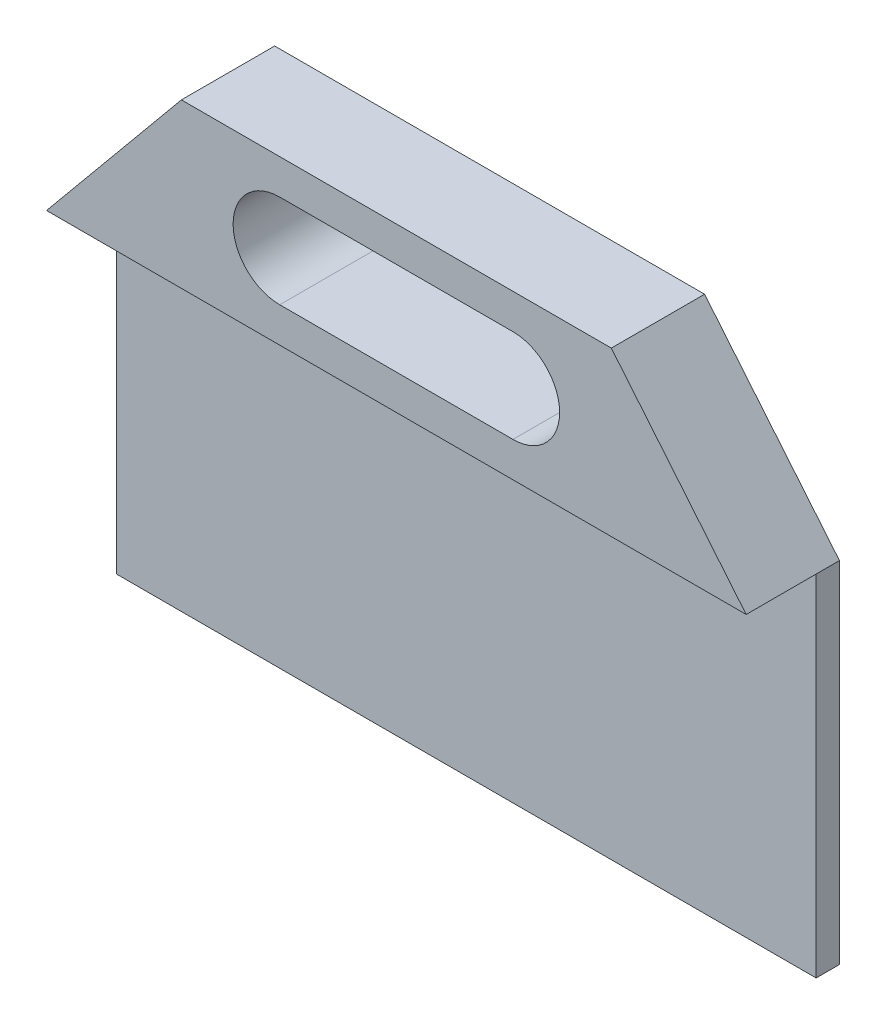
ISO-10303-21;
HEADER;
FILE_DESCRIPTION(('STEP AP214'),'2;1');
FILE_NAME('part.step','',(''),(''),'','','');
FILE_SCHEMA(('AUTOMOTIVE_DESIGN { 1 0 10303 214 1 1 1 1 }'));
ENDSEC;
DATA;
#1=APPLICATION_CONTEXT('core data for automotive mechanical design processes');
#2=APPLICATION_PROTOCOL_DEFINITION('international standard','automotive_design',2000,#1);
#3=PRODUCT_CONTEXT('',#1,'mechanical');
#4=PRODUCT('Part','Part','',(#3));
#5=PRODUCT_RELATED_PRODUCT_CATEGORY('part','',(#4));
#6=PRODUCT_DEFINITION_FORMATION('','',#4);
#7=PRODUCT_DEFINITION_CONTEXT('part definition',#1,'design');
#8=PRODUCT_DEFINITION('design','',#6,#7);
#9=PRODUCT_DEFINITION_SHAPE('','',#8);
#10=(LENGTH_UNIT() NAMED_UNIT(*) SI_UNIT(.MILLI.,.METRE.));
#11=(NAMED_UNIT(*) PLANE_ANGLE_UNIT() SI_UNIT($,.RADIAN.));
#12=(NAMED_UNIT(*) SI_UNIT($,.STERADIAN.) SOLID_ANGLE_UNIT());
#13=UNCERTAINTY_MEASURE_WITH_UNIT(LENGTH_MEASURE(1.E-05),#10,'distance_accuracy_value','');
#14=(GEOMETRIC_REPRESENTATION_CONTEXT(3) GLOBAL_UNCERTAINTY_ASSIGNED_CONTEXT((#13)) GLOBAL_UNIT_ASSIGNED_CONTEXT((#10,
#11,#12)) REPRESENTATION_CONTEXT('',''));
#15=CARTESIAN_POINT('',(0.,0.,0.));
#16=DIRECTION('',(0.,0.,1.));
#17=DIRECTION('',(1.,0.,0.));
#18=AXIS2_PLACEMENT_3D('',#15,#16,#17);
#19=CARTESIAN_POINT('',(-15.,0.,1.));
#20=DIRECTION('',(-1.,0.,0.));
#21=DIRECTION('',(0.,0.,1.));
#22=AXIS2_PLACEMENT_3D('',#19,#20,#21);
#23=PLANE('',#22);
#24=DIRECTION('',(0.,1.,0.));
#25=VECTOR('',#24,1.);
#26=CARTESIAN_POINT('',(-15.,0.,0.));
#27=LINE('',#26,#25);
#28=CARTESIAN_POINT('',(-15.,-7.50000000000001,0.));
#29=VERTEX_POINT('',#28);
#30=CARTESIAN_POINT('',(-15.,7.49999999999999,0.));
#31=VERTEX_POINT('',#30);
#32=EDGE_CURVE('E80',#29,#31,#27,.T.);
#33=ORIENTED_EDGE('',*,*,#32,.F.);
#34=DIRECTION('',(0.,0.,-1.));
#35=VECTOR('',#34,1.);
#36=CARTESIAN_POINT('',(-15.,-7.50000000000001,1.));
#37=LINE('',#36,#35);
#38=CARTESIAN_POINT('',(-15.,-7.50000000000001,1.));
#39=VERTEX_POINT('',#38);
#40=EDGE_CURVE('E11',#39,#29,#37,.T.);
#41=ORIENTED_EDGE('',*,*,#40,.F.);
#42=DIRECTION('',(0.,1.,0.));
#43=VECTOR('',#42,1.);
#44=CARTESIAN_POINT('',(-15.,0.,1.));
#45=LINE('',#44,#43);
#46=CARTESIAN_POINT('',(-15.,7.49999999999999,1.));
#47=VERTEX_POINT('',#46);
#48=EDGE_CURVE('E78',#39,#47,#45,.T.);
#49=ORIENTED_EDGE('',*,*,#48,.T.);
#50=DIRECTION('',(0.,0.,-1.));
#51=VECTOR('',#50,1.);
#52=CARTESIAN_POINT('',(-15.,7.49999999999999,1.));
#53=LINE('',#52,#51);
#54=EDGE_CURVE('E97',#47,#31,#53,.T.);
#55=ORIENTED_EDGE('',*,*,#54,.T.);
#56=EDGE_LOOP('',(#33,#41,#49,#55));
#57=FACE_BOUND('',#56,.T.);
#58=ADVANCED_FACE('F33',(#57),#23,.T.);
#59=CARTESIAN_POINT('',(0.,-7.50000000000001,1.));
#60=DIRECTION('',(0.,-1.,0.));
#61=DIRECTION('',(1.,0.,0.));
#62=AXIS2_PLACEMENT_3D('',#59,#60,#61);
#63=PLANE('',#62);
#64=DIRECTION('',(-1.,0.,0.));
#65=VECTOR('',#64,1.);
#66=CARTESIAN_POINT('',(0.,-7.50000000000001,0.));
#67=LINE('',#66,#65);
#68=CARTESIAN_POINT('',(15.,-7.50000000000001,0.));
#69=VERTEX_POINT('',#68);
#70=EDGE_CURVE('E99',#69,#29,#67,.T.);
#71=ORIENTED_EDGE('',*,*,#70,.F.);
#72=DIRECTION('',(0.,0.,-1.));
#73=VECTOR('',#72,1.);
#74=CARTESIAN_POINT('',(15.,-7.50000000000001,1.));
#75=LINE('',#74,#73);
#76=CARTESIAN_POINT('',(15.,-7.50000000000001,1.));
#77=VERTEX_POINT('',#76);
#78=EDGE_CURVE('E41',#77,#69,#75,.T.);
#79=ORIENTED_EDGE('',*,*,#78,.F.);
#80=DIRECTION('',(-1.,0.,0.));
#81=VECTOR('',#80,1.);
#82=CARTESIAN_POINT('',(0.,-7.50000000000001,1.));
#83=LINE('',#82,#81);
#84=EDGE_CURVE('E86',#77,#39,#83,.T.);
#85=ORIENTED_EDGE('',*,*,#84,.T.);
#86=ORIENTED_EDGE('',*,*,#40,.T.);
#87=EDGE_LOOP('',(#71,#79,#85,#86));
#88=FACE_BOUND('',#87,.T.);
#89=ADVANCED_FACE('F89',(#88),#63,.T.);
#90=CARTESIAN_POINT('',(15.,0.,1.));
#91=DIRECTION('',(-1.,0.,0.));
#92=DIRECTION('',(0.,-1.,0.));
#93=AXIS2_PLACEMENT_3D('',#90,#91,#92);
#94=PLANE('',#93);
#95=DIRECTION('',(0.,1.,0.));
#96=VECTOR('',#95,1.);
#97=CARTESIAN_POINT('',(15.,0.,0.));
#98=LINE('',#97,#96);
#99=CARTESIAN_POINT('',(15.,7.49999999999999,0.));
#100=VERTEX_POINT('',#99);
#101=EDGE_CURVE('E87',#69,#100,#98,.T.);
#102=ORIENTED_EDGE('',*,*,#101,.T.);
#103=DIRECTION('',(0.,0.,-1.));
#104=VECTOR('',#103,1.);
#105=CARTESIAN_POINT('',(15.,7.49999999999999,1.));
#106=LINE('',#105,#104);
#107=CARTESIAN_POINT('',(15.,7.49999999999999,1.));
#108=VERTEX_POINT('',#107);
#109=EDGE_CURVE('E105',#108,#100,#106,.T.);
#110=ORIENTED_EDGE('',*,*,#109,.F.);
#111=DIRECTION('',(0.,1.,0.));
#112=VECTOR('',#111,1.);
#113=CARTESIAN_POINT('',(15.,0.,1.));
#114=LINE('',#113,#112);
#115=EDGE_CURVE('E91',#77,#108,#114,.T.);
#116=ORIENTED_EDGE('',*,*,#115,.F.);
#117=ORIENTED_EDGE('',*,*,#78,.T.);
#118=EDGE_LOOP('',(#102,#110,#116,#117));
#119=FACE_BOUND('',#118,.T.);
#120=ADVANCED_FACE('F109',(#119),#94,.F.);
#121=CARTESIAN_POINT('',(0.,0.,1.));
#122=DIRECTION('',(0.,0.,1.));
#123=DIRECTION('',(1.,0.,0.));
#124=AXIS2_PLACEMENT_3D('',#121,#122,#123);
#125=PLANE('',#124);
#126=ORIENTED_EDGE('',*,*,#48,.F.);
#127=ORIENTED_EDGE('',*,*,#84,.F.);
#128=ORIENTED_EDGE('',*,*,#115,.T.);
#129=DIRECTION('',(-1.,0.,0.));
#130=VECTOR('',#129,1.);
#131=CARTESIAN_POINT('',(0.,7.49999999999999,1.));
#132=LINE('',#131,#130);
#133=EDGE_CURVE('E67',#108,#47,#132,.T.);
#134=ORIENTED_EDGE('',*,*,#133,.T.);
#135=EDGE_LOOP('',(#126,#127,#128,#134));
#136=FACE_BOUND('',#135,.T.);
#137=ADVANCED_FACE('F84',(#136),#125,.T.);
#138=CARTESIAN_POINT('',(0.,0.,0.));
#139=DIRECTION('',(0.,0.,1.));
#140=DIRECTION('',(1.,0.,0.));
#141=AXIS2_PLACEMENT_3D('',#138,#139,#140);
#142=PLANE('',#141);
#143=ORIENTED_EDGE('',*,*,#32,.T.);
#144=DIRECTION('',(0.63688985212534,0.77095480818253,0.));
#145=VECTOR('',#144,1.);
#146=CARTESIAN_POINT('',(-12.5981694472366,10.4074145347322,0.));
#147=LINE('',#146,#145);
#148=CARTESIAN_POINT('',(-9.21726290885022,14.5,0.));
#149=VERTEX_POINT('',#148);
#150=EDGE_CURVE('E129',#31,#149,#147,.T.);
#151=ORIENTED_EDGE('',*,*,#150,.T.);
#152=DIRECTION('',(1.,0.,0.));
#153=VECTOR('',#152,1.);
#154=CARTESIAN_POINT('',(0.,14.5,0.));
#155=LINE('',#154,#153);
#156=CARTESIAN_POINT('',(9.21726290885023,14.5,0.));
#157=VERTEX_POINT('',#156);
#158=EDGE_CURVE('E122',#149,#157,#155,.T.);
#159=ORIENTED_EDGE('',*,*,#158,.T.);
#160=DIRECTION('',(-0.63688985212534,0.770954808182531,0.));
#161=VECTOR('',#160,1.);
#162=CARTESIAN_POINT('',(12.5981694472366,10.4074145347322,0.));
#163=LINE('',#162,#161);
#164=EDGE_CURVE('E118',#100,#157,#163,.T.);
#165=ORIENTED_EDGE('',*,*,#164,.F.);
#166=ORIENTED_EDGE('',*,*,#101,.F.);
#167=ORIENTED_EDGE('',*,*,#70,.T.);
#168=EDGE_LOOP('',(#143,#151,#159,#165,#166,#167));
#169=FACE_BOUND('',#168,.T.);
#170=CARTESIAN_POINT('',(5.,11.,0.));
#171=DIRECTION('',(0.,0.,1.));
#172=DIRECTION('',(1.,0.,0.));
#173=AXIS2_PLACEMENT_3D('',#170,#171,#172);
#174=CIRCLE('',#173,2.);
#175=CARTESIAN_POINT('',(5.,9.,0.));
#176=VERTEX_POINT('',#175);
#177=CARTESIAN_POINT('',(5.,13.,0.));
#178=VERTEX_POINT('',#177);
#179=EDGE_CURVE('E177',#176,#178,#174,.T.);
#180=ORIENTED_EDGE('',*,*,#179,.T.);
#181=DIRECTION('',(1.,0.,0.));
#182=VECTOR('',#181,1.);
#183=CARTESIAN_POINT('',(0.,13.,0.));
#184=LINE('',#183,#182);
#185=CARTESIAN_POINT('',(-5.,13.,0.));
#186=VERTEX_POINT('',#185);
#187=EDGE_CURVE('E127',#186,#178,#184,.T.);
#188=ORIENTED_EDGE('',*,*,#187,.F.);
#189=CARTESIAN_POINT('',(-5.,11.,0.));
#190=DIRECTION('',(0.,0.,1.));
#191=DIRECTION('',(1.,0.,0.));
#192=AXIS2_PLACEMENT_3D('',#189,#190,#191);
#193=CIRCLE('',#192,2.);
#194=CARTESIAN_POINT('',(-5.,8.99999999999999,0.));
#195=VERTEX_POINT('',#194);
#196=EDGE_CURVE('E132',#186,#195,#193,.T.);
#197=ORIENTED_EDGE('',*,*,#196,.T.);
#198=DIRECTION('',(1.,0.,0.));
#199=VECTOR('',#198,1.);
#200=CARTESIAN_POINT('',(0.,8.99999999999999,0.));
#201=LINE('',#200,#199);
#202=EDGE_CURVE('E167',#195,#176,#201,.T.);
#203=ORIENTED_EDGE('',*,*,#202,.T.);
#204=EDGE_LOOP('',(#180,#188,#197,#203));
#205=FACE_BOUND('',#204,.T.);
#206=ADVANCED_FACE('F114',(#169,#205),#142,.F.);
#207=CARTESIAN_POINT('',(0.,7.49999999999999,4.));
#208=DIRECTION('',(0.,-1.,0.));
#209=DIRECTION('',(1.,0.,0.));
#210=AXIS2_PLACEMENT_3D('',#207,#208,#209);
#211=PLANE('',#210);
#212=ORIENTED_EDGE('',*,*,#133,.F.);
#213=DIRECTION('',(0.,0.,-1.));
#214=VECTOR('',#213,1.);
#215=CARTESIAN_POINT('',(15.,7.49999999999999,4.));
#216=LINE('',#215,#214);
#217=CARTESIAN_POINT('',(15.,7.49999999999999,4.));
#218=VERTEX_POINT('',#217);
#219=EDGE_CURVE('E100',#218,#108,#216,.T.);
#220=ORIENTED_EDGE('',*,*,#219,.F.);
#221=DIRECTION('',(-1.,0.,0.));
#222=VECTOR('',#221,1.);
#223=CARTESIAN_POINT('',(0.,7.49999999999999,4.));
#224=LINE('',#223,#222);
#225=CARTESIAN_POINT('',(-15.,7.49999999999999,4.));
#226=VERTEX_POINT('',#225);
#227=EDGE_CURVE('E193',#218,#226,#224,.T.);
#228=ORIENTED_EDGE('',*,*,#227,.T.);
#229=DIRECTION('',(0.,0.,-1.));
#230=VECTOR('',#229,1.);
#231=CARTESIAN_POINT('',(-15.,7.49999999999999,4.));
#232=LINE('',#231,#230);
#233=EDGE_CURVE('E49',#226,#47,#232,.T.);
#234=ORIENTED_EDGE('',*,*,#233,.T.);
#235=EDGE_LOOP('',(#212,#220,#228,#234));
#236=FACE_BOUND('',#235,.T.);
#237=ADVANCED_FACE('F237',(#236),#211,.T.);
#238=CARTESIAN_POINT('',(12.5981694472366,10.4074145347322,4.));
#239=DIRECTION('',(-0.770954808182531,-0.63688985212534,0.));
#240=DIRECTION('',(0.63688985212534,-0.770954808182531,0.));
#241=AXIS2_PLACEMENT_3D('',#238,#239,#240);
#242=PLANE('',#241);
#243=ORIENTED_EDGE('',*,*,#164,.T.);
#244=DIRECTION('',(0.,0.,-1.));
#245=VECTOR('',#244,1.);
#246=CARTESIAN_POINT('',(9.21726290885023,14.5,4.));
#247=LINE('',#246,#245);
#248=CARTESIAN_POINT('',(9.21726290885023,14.5,4.));
#249=VERTEX_POINT('',#248);
#250=EDGE_CURVE('E143',#249,#157,#247,.T.);
#251=ORIENTED_EDGE('',*,*,#250,.F.);
#252=DIRECTION('',(-0.63688985212534,0.770954808182531,0.));
#253=VECTOR('',#252,1.);
#254=CARTESIAN_POINT('',(12.5981694472366,10.4074145347322,4.));
#255=LINE('',#254,#253);
#256=EDGE_CURVE('E190',#218,#249,#255,.T.);
#257=ORIENTED_EDGE('',*,*,#256,.F.);
#258=ORIENTED_EDGE('',*,*,#219,.T.);
#259=ORIENTED_EDGE('',*,*,#109,.T.);
#260=EDGE_LOOP('',(#243,#251,#257,#258,#259));
#261=FACE_BOUND('',#260,.T.);
#262=ADVANCED_FACE('F235',(#261),#242,.F.);
#263=CARTESIAN_POINT('',(0.,14.5,4.));
#264=DIRECTION('',(0.,1.,0.));
#265=DIRECTION('',(-1.,0.,0.));
#266=AXIS2_PLACEMENT_3D('',#263,#264,#265);
#267=PLANE('',#266);
#268=ORIENTED_EDGE('',*,*,#158,.F.);
#269=DIRECTION('',(0.,0.,-1.));
#270=VECTOR('',#269,1.);
#271=CARTESIAN_POINT('',(-9.21726290885022,14.5,4.));
#272=LINE('',#271,#270);
#273=CARTESIAN_POINT('',(-9.21726290885022,14.5,4.));
#274=VERTEX_POINT('',#273);
#275=EDGE_CURVE('E139',#274,#149,#272,.T.);
#276=ORIENTED_EDGE('',*,*,#275,.F.);
#277=DIRECTION('',(1.,0.,0.));
#278=VECTOR('',#277,1.);
#279=CARTESIAN_POINT('',(0.,14.5,4.));
#280=LINE('',#279,#278);
#281=EDGE_CURVE('E187',#274,#249,#280,.T.);
#282=ORIENTED_EDGE('',*,*,#281,.T.);
#283=ORIENTED_EDGE('',*,*,#250,.T.);
#284=EDGE_LOOP('',(#268,#276,#282,#283));
#285=FACE_BOUND('',#284,.T.);
#286=ADVANCED_FACE('F233',(#285),#267,.T.);
#287=CARTESIAN_POINT('',(5.,11.,4.));
#288=DIRECTION('',(0.,0.,-1.));
#289=DIRECTION('',(-1.,0.,0.));
#290=AXIS2_PLACEMENT_3D('',#287,#288,#289);
#291=CYLINDRICAL_SURFACE('',#290,2.);
#292=ORIENTED_EDGE('',*,*,#179,.F.);
#293=DIRECTION('',(0.,0.,-1.));
#294=VECTOR('',#293,1.);
#295=CARTESIAN_POINT('',(5.,9.,4.));
#296=LINE('',#295,#294);
#297=CARTESIAN_POINT('',(5.,9.,4.));
#298=VERTEX_POINT('',#297);
#299=EDGE_CURVE('E140',#298,#176,#296,.T.);
#300=ORIENTED_EDGE('',*,*,#299,.F.);
#301=CARTESIAN_POINT('',(5.,11.,4.));
#302=DIRECTION('',(0.,0.,1.));
#303=DIRECTION('',(1.,0.,0.));
#304=AXIS2_PLACEMENT_3D('',#301,#302,#303);
#305=CIRCLE('',#304,2.);
#306=CARTESIAN_POINT('',(5.,13.,4.));
#307=VERTEX_POINT('',#306);
#308=EDGE_CURVE('E137',#298,#307,#305,.T.);
#309=ORIENTED_EDGE('',*,*,#308,.T.);
#310=DIRECTION('',(0.,0.,-1.));
#311=VECTOR('',#310,1.);
#312=CARTESIAN_POINT('',(5.,13.,4.));
#313=LINE('',#312,#311);
#314=EDGE_CURVE('E147',#307,#178,#313,.T.);
#315=ORIENTED_EDGE('',*,*,#314,.T.);
#316=EDGE_LOOP('',(#292,#300,#309,#315));
#317=FACE_BOUND('',#316,.T.);
#318=ADVANCED_FACE('F178',(#317),#291,.F.);
#319=CARTESIAN_POINT('',(0.,8.99999999999999,4.));
#320=DIRECTION('',(0.,1.,0.));
#321=DIRECTION('',(-1.,0.,0.));
#322=AXIS2_PLACEMENT_3D('',#319,#320,#321);
#323=PLANE('',#322);
#324=ORIENTED_EDGE('',*,*,#202,.F.);
#325=DIRECTION('',(0.,0.,-1.));
#326=VECTOR('',#325,1.);
#327=CARTESIAN_POINT('',(-5.,8.99999999999999,4.));
#328=LINE('',#327,#326);
#329=CARTESIAN_POINT('',(-5.,8.99999999999999,4.));
#330=VERTEX_POINT('',#329);
#331=EDGE_CURVE('E154',#330,#195,#328,.T.);
#332=ORIENTED_EDGE('',*,*,#331,.F.);
#333=DIRECTION('',(1.,0.,0.));
#334=VECTOR('',#333,1.);
#335=CARTESIAN_POINT('',(0.,8.99999999999999,4.));
#336=LINE('',#335,#334);
#337=EDGE_CURVE('E171',#330,#298,#336,.T.);
#338=ORIENTED_EDGE('',*,*,#337,.T.);
#339=ORIENTED_EDGE('',*,*,#299,.T.);
#340=EDGE_LOOP('',(#324,#332,#338,#339));
#341=FACE_BOUND('',#340,.T.);
#342=ADVANCED_FACE('F163',(#341),#323,.T.);
#343=CARTESIAN_POINT('',(-5.,11.,4.));
#344=DIRECTION('',(0.,0.,-1.));
#345=DIRECTION('',(-1.,0.,0.));
#346=AXIS2_PLACEMENT_3D('',#343,#344,#345);
#347=CYLINDRICAL_SURFACE('',#346,2.);
#348=ORIENTED_EDGE('',*,*,#196,.F.);
#349=DIRECTION('',(0.,0.,-1.));
#350=VECTOR('',#349,1.);
#351=CARTESIAN_POINT('',(-5.,13.,4.));
#352=LINE('',#351,#350);
#353=CARTESIAN_POINT('',(-5.,13.,4.));
#354=VERTEX_POINT('',#353);
#355=EDGE_CURVE('E150',#354,#186,#352,.T.);
#356=ORIENTED_EDGE('',*,*,#355,.F.);
#357=CARTESIAN_POINT('',(-5.,11.,4.));
#358=DIRECTION('',(0.,0.,1.));
#359=DIRECTION('',(1.,0.,0.));
#360=AXIS2_PLACEMENT_3D('',#357,#358,#359);
#361=CIRCLE('',#360,2.);
#362=EDGE_CURVE('E198',#354,#330,#361,.T.);
#363=ORIENTED_EDGE('',*,*,#362,.T.);
#364=ORIENTED_EDGE('',*,*,#331,.T.);
#365=EDGE_LOOP('',(#348,#356,#363,#364));
#366=FACE_BOUND('',#365,.T.);
#367=ADVANCED_FACE('F262',(#366),#347,.F.);
#368=CARTESIAN_POINT('',(0.,13.,4.));
#369=DIRECTION('',(0.,1.,0.));
#370=DIRECTION('',(-1.,0.,0.));
#371=AXIS2_PLACEMENT_3D('',#368,#369,#370);
#372=PLANE('',#371);
#373=ORIENTED_EDGE('',*,*,#187,.T.);
#374=ORIENTED_EDGE('',*,*,#314,.F.);
#375=DIRECTION('',(1.,0.,0.));
#376=VECTOR('',#375,1.);
#377=CARTESIAN_POINT('',(0.,13.,4.));
#378=LINE('',#377,#376);
#379=EDGE_CURVE('E195',#354,#307,#378,.T.);
#380=ORIENTED_EDGE('',*,*,#379,.F.);
#381=ORIENTED_EDGE('',*,*,#355,.T.);
#382=EDGE_LOOP('',(#373,#374,#380,#381));
#383=FACE_BOUND('',#382,.T.);
#384=ADVANCED_FACE('F264',(#383),#372,.F.);
#385=CARTESIAN_POINT('',(-12.5981694472366,10.4074145347322,4.));
#386=DIRECTION('',(-0.77095480818253,0.63688985212534,0.));
#387=DIRECTION('',(-0.63688985212534,-0.77095480818253,0.));
#388=AXIS2_PLACEMENT_3D('',#385,#386,#387);
#389=PLANE('',#388);
#390=ORIENTED_EDGE('',*,*,#150,.F.);
#391=ORIENTED_EDGE('',*,*,#54,.F.);
#392=ORIENTED_EDGE('',*,*,#233,.F.);
#393=DIRECTION('',(0.63688985212534,0.77095480818253,0.));
#394=VECTOR('',#393,1.);
#395=CARTESIAN_POINT('',(-12.5981694472366,10.4074145347322,4.));
#396=LINE('',#395,#394);
#397=EDGE_CURVE('E151',#226,#274,#396,.T.);
#398=ORIENTED_EDGE('',*,*,#397,.T.);
#399=ORIENTED_EDGE('',*,*,#275,.T.);
#400=EDGE_LOOP('',(#390,#391,#392,#398,#399));
#401=FACE_BOUND('',#400,.T.);
#402=ADVANCED_FACE('F229',(#401),#389,.T.);
#403=CARTESIAN_POINT('',(0.,0.,4.));
#404=DIRECTION('',(0.,0.,1.));
#405=DIRECTION('',(1.,0.,0.));
#406=AXIS2_PLACEMENT_3D('',#403,#404,#405);
#407=PLANE('',#406);
#408=ORIENTED_EDGE('',*,*,#308,.F.);
#409=ORIENTED_EDGE('',*,*,#337,.F.);
#410=ORIENTED_EDGE('',*,*,#362,.F.);
#411=ORIENTED_EDGE('',*,*,#379,.T.);
#412=EDGE_LOOP('',(#408,#409,#410,#411));
#413=FACE_BOUND('',#412,.T.);
#414=ORIENTED_EDGE('',*,*,#227,.F.);
#415=ORIENTED_EDGE('',*,*,#256,.T.);
#416=ORIENTED_EDGE('',*,*,#281,.F.);
#417=ORIENTED_EDGE('',*,*,#397,.F.);
#418=EDGE_LOOP('',(#414,#415,#416,#417));
#419=FACE_BOUND('',#418,.T.);
#420=ADVANCED_FACE('F207',(#413,#419),#407,.T.);
#421=CLOSED_SHELL('',(#58,#89,#120,#137,#206,#237,#262,#286,#318,#342,#367,#384,#402,#420));
#422=MANIFOLD_SOLID_BREP('B2',#421);
#423=ADVANCED_BREP_SHAPE_REPRESENTATION('',(#18,#422),#14);
#424=SHAPE_DEFINITION_REPRESENTATION(#9,#423);
ENDSEC;
END-ISO-10303-21;
